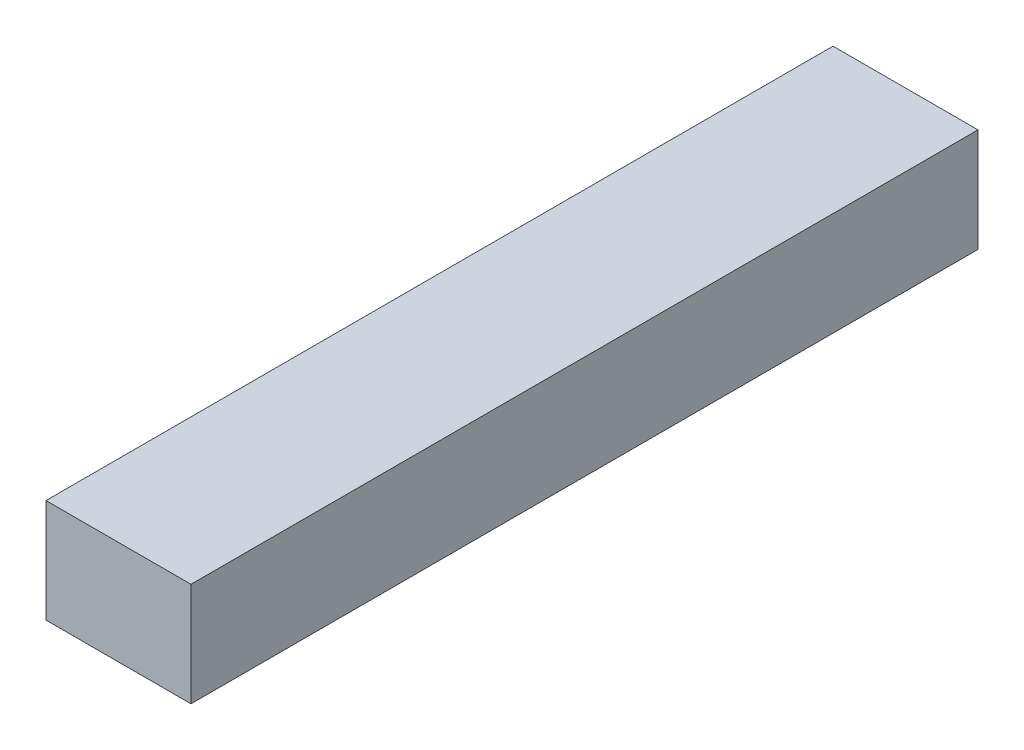
ISO-10303-21;
HEADER;
FILE_DESCRIPTION(('STEP AP214'),'2;1');
FILE_NAME('part.step','',(''),(''),'','','');
FILE_SCHEMA(('AUTOMOTIVE_DESIGN { 1 0 10303 214 1 1 1 1 }'));
ENDSEC;
DATA;
#1=APPLICATION_CONTEXT('core data for automotive mechanical design processes');
#2=APPLICATION_PROTOCOL_DEFINITION('international standard','automotive_design',2000,#1);
#3=PRODUCT_CONTEXT('',#1,'mechanical');
#4=PRODUCT('Part','Part','',(#3));
#5=PRODUCT_RELATED_PRODUCT_CATEGORY('part','',(#4));
#6=PRODUCT_DEFINITION_FORMATION('','',#4);
#7=PRODUCT_DEFINITION_CONTEXT('part definition',#1,'design');
#8=PRODUCT_DEFINITION('design','',#6,#7);
#9=PRODUCT_DEFINITION_SHAPE('','',#8);
#10=(LENGTH_UNIT() NAMED_UNIT(*) SI_UNIT(.MILLI.,.METRE.));
#11=(NAMED_UNIT(*) PLANE_ANGLE_UNIT() SI_UNIT($,.RADIAN.));
#12=(NAMED_UNIT(*) SI_UNIT($,.STERADIAN.) SOLID_ANGLE_UNIT());
#13=UNCERTAINTY_MEASURE_WITH_UNIT(LENGTH_MEASURE(1.E-05),#10,'distance_accuracy_value','');
#14=(GEOMETRIC_REPRESENTATION_CONTEXT(3) GLOBAL_UNCERTAINTY_ASSIGNED_CONTEXT((#13)) GLOBAL_UNIT_ASSIGNED_CONTEXT((#10,
#11,#12)) REPRESENTATION_CONTEXT('',''));
#15=CARTESIAN_POINT('',(0.,0.,0.));
#16=DIRECTION('',(0.,0.,1.));
#17=DIRECTION('',(1.,0.,0.));
#18=AXIS2_PLACEMENT_3D('',#15,#16,#17);
#19=CARTESIAN_POINT('',(7.,5.,38.));
#20=DIRECTION('',(-1.,0.,0.));
#21=DIRECTION('',(0.,-1.,0.));
#22=AXIS2_PLACEMENT_3D('',#19,#20,#21);
#23=PLANE('',#22);
#24=DIRECTION('',(0.,1.,0.));
#25=VECTOR('',#24,1.);
#26=CARTESIAN_POINT('',(7.,5.,-38.));
#27=LINE('',#26,#25);
#28=CARTESIAN_POINT('',(7.,-5.,-38.));
#29=VERTEX_POINT('',#28);
#30=CARTESIAN_POINT('',(7.,5.,-38.));
#31=VERTEX_POINT('',#30);
#32=EDGE_CURVE('E99',#29,#31,#27,.T.);
#33=ORIENTED_EDGE('',*,*,#32,.T.);
#34=DIRECTION('',(0.,0.,-1.));
#35=VECTOR('',#34,1.);
#36=CARTESIAN_POINT('',(7.,5.,38.));
#37=LINE('',#36,#35);
#38=CARTESIAN_POINT('',(7.,5.,38.));
#39=VERTEX_POINT('',#38);
#40=EDGE_CURVE('E11',#39,#31,#37,.T.);
#41=ORIENTED_EDGE('',*,*,#40,.F.);
#42=DIRECTION('',(0.,1.,0.));
#43=VECTOR('',#42,1.);
#44=CARTESIAN_POINT('',(7.,5.,38.));
#45=LINE('',#44,#43);
#46=CARTESIAN_POINT('',(7.,-5.,38.));
#47=VERTEX_POINT('',#46);
#48=EDGE_CURVE('E87',#47,#39,#45,.T.);
#49=ORIENTED_EDGE('',*,*,#48,.F.);
#50=DIRECTION('',(0.,0.,-1.));
#51=VECTOR('',#50,1.);
#52=CARTESIAN_POINT('',(7.,-5.,38.));
#53=LINE('',#52,#51);
#54=EDGE_CURVE('E95',#47,#29,#53,.T.);
#55=ORIENTED_EDGE('',*,*,#54,.T.);
#56=EDGE_LOOP('',(#33,#41,#49,#55));
#57=FACE_BOUND('',#56,.T.);
#58=ADVANCED_FACE('F36',(#57),#23,.F.);
#59=CARTESIAN_POINT('',(-7.,5.,38.));
#60=DIRECTION('',(0.,-1.,0.));
#61=DIRECTION('',(0.,0.,-1.));
#62=AXIS2_PLACEMENT_3D('',#59,#60,#61);
#63=PLANE('',#62);
#64=DIRECTION('',(-1.,0.,0.));
#65=VECTOR('',#64,1.);
#66=CARTESIAN_POINT('',(-7.,5.,-38.));
#67=LINE('',#66,#65);
#68=CARTESIAN_POINT('',(-7.,5.,-38.));
#69=VERTEX_POINT('',#68);
#70=EDGE_CURVE('E91',#31,#69,#67,.T.);
#71=ORIENTED_EDGE('',*,*,#70,.T.);
#72=DIRECTION('',(0.,0.,-1.));
#73=VECTOR('',#72,1.);
#74=CARTESIAN_POINT('',(-7.,5.,38.));
#75=LINE('',#74,#73);
#76=CARTESIAN_POINT('',(-7.,5.,38.));
#77=VERTEX_POINT('',#76);
#78=EDGE_CURVE('E44',#77,#69,#75,.T.);
#79=ORIENTED_EDGE('',*,*,#78,.F.);
#80=DIRECTION('',(-1.,0.,0.));
#81=VECTOR('',#80,1.);
#82=CARTESIAN_POINT('',(-7.,5.,38.));
#83=LINE('',#82,#81);
#84=EDGE_CURVE('E82',#39,#77,#83,.T.);
#85=ORIENTED_EDGE('',*,*,#84,.F.);
#86=ORIENTED_EDGE('',*,*,#40,.T.);
#87=EDGE_LOOP('',(#71,#79,#85,#86));
#88=FACE_BOUND('',#87,.T.);
#89=ADVANCED_FACE('F90',(#88),#63,.F.);
#90=CARTESIAN_POINT('',(-7.,5.,38.));
#91=DIRECTION('',(1.,0.,0.));
#92=DIRECTION('',(0.,1.,0.));
#93=AXIS2_PLACEMENT_3D('',#90,#91,#92);
#94=PLANE('',#93);
#95=DIRECTION('',(0.,-1.,0.));
#96=VECTOR('',#95,1.);
#97=CARTESIAN_POINT('',(-7.,5.,-38.));
#98=LINE('',#97,#96);
#99=CARTESIAN_POINT('',(-7.,-5.,-38.));
#100=VERTEX_POINT('',#99);
#101=EDGE_CURVE('E69',#69,#100,#98,.T.);
#102=ORIENTED_EDGE('',*,*,#101,.T.);
#103=DIRECTION('',(0.,0.,-1.));
#104=VECTOR('',#103,1.);
#105=CARTESIAN_POINT('',(-7.,-5.,38.));
#106=LINE('',#105,#104);
#107=CARTESIAN_POINT('',(-7.,-5.,38.));
#108=VERTEX_POINT('',#107);
#109=EDGE_CURVE('E92',#108,#100,#106,.T.);
#110=ORIENTED_EDGE('',*,*,#109,.F.);
#111=DIRECTION('',(0.,-1.,0.));
#112=VECTOR('',#111,1.);
#113=CARTESIAN_POINT('',(-7.,5.,38.));
#114=LINE('',#113,#112);
#115=EDGE_CURVE('E85',#77,#108,#114,.T.);
#116=ORIENTED_EDGE('',*,*,#115,.F.);
#117=ORIENTED_EDGE('',*,*,#78,.T.);
#118=EDGE_LOOP('',(#102,#110,#116,#117));
#119=FACE_BOUND('',#118,.T.);
#120=ADVANCED_FACE('F93',(#119),#94,.F.);
#121=CARTESIAN_POINT('',(-7.,-5.,38.));
#122=DIRECTION('',(0.,1.,0.));
#123=DIRECTION('',(0.,0.,1.));
#124=AXIS2_PLACEMENT_3D('',#121,#122,#123);
#125=PLANE('',#124);
#126=DIRECTION('',(1.,0.,0.));
#127=VECTOR('',#126,1.);
#128=CARTESIAN_POINT('',(-7.,-5.,-38.));
#129=LINE('',#128,#127);
#130=EDGE_CURVE('E75',#100,#29,#129,.T.);
#131=ORIENTED_EDGE('',*,*,#130,.T.);
#132=ORIENTED_EDGE('',*,*,#54,.F.);
#133=DIRECTION('',(1.,0.,0.));
#134=VECTOR('',#133,1.);
#135=CARTESIAN_POINT('',(-7.,-5.,38.));
#136=LINE('',#135,#134);
#137=EDGE_CURVE('E52',#108,#47,#136,.T.);
#138=ORIENTED_EDGE('',*,*,#137,.F.);
#139=ORIENTED_EDGE('',*,*,#109,.T.);
#140=EDGE_LOOP('',(#131,#132,#138,#139));
#141=FACE_BOUND('',#140,.T.);
#142=ADVANCED_FACE('F106',(#141),#125,.F.);
#143=CARTESIAN_POINT('',(0.,0.,38.));
#144=DIRECTION('',(0.,0.,1.));
#145=DIRECTION('',(1.,0.,0.));
#146=AXIS2_PLACEMENT_3D('',#143,#144,#145);
#147=PLANE('',#146);
#148=ORIENTED_EDGE('',*,*,#48,.T.);
#149=ORIENTED_EDGE('',*,*,#84,.T.);
#150=ORIENTED_EDGE('',*,*,#115,.T.);
#151=ORIENTED_EDGE('',*,*,#137,.T.);
#152=EDGE_LOOP('',(#148,#149,#150,#151));
#153=FACE_BOUND('',#152,.T.);
#154=ADVANCED_FACE('F83',(#153),#147,.T.);
#155=CARTESIAN_POINT('',(0.,0.,-38.));
#156=DIRECTION('',(0.,0.,1.));
#157=DIRECTION('',(1.,0.,0.));
#158=AXIS2_PLACEMENT_3D('',#155,#156,#157);
#159=PLANE('',#158);
#160=ORIENTED_EDGE('',*,*,#32,.F.);
#161=ORIENTED_EDGE('',*,*,#130,.F.);
#162=ORIENTED_EDGE('',*,*,#101,.F.);
#163=ORIENTED_EDGE('',*,*,#70,.F.);
#164=EDGE_LOOP('',(#160,#161,#162,#163));
#165=FACE_BOUND('',#164,.T.);
#166=ADVANCED_FACE('F109',(#165),#159,.F.);
#167=CLOSED_SHELL('',(#58,#89,#120,#142,#154,#166));
#168=MANIFOLD_SOLID_BREP('B2',#167);
#169=ADVANCED_BREP_SHAPE_REPRESENTATION('',(#18,#168),#14);
#170=SHAPE_DEFINITION_REPRESENTATION(#9,#169);
ENDSEC;
END-ISO-10303-21;
